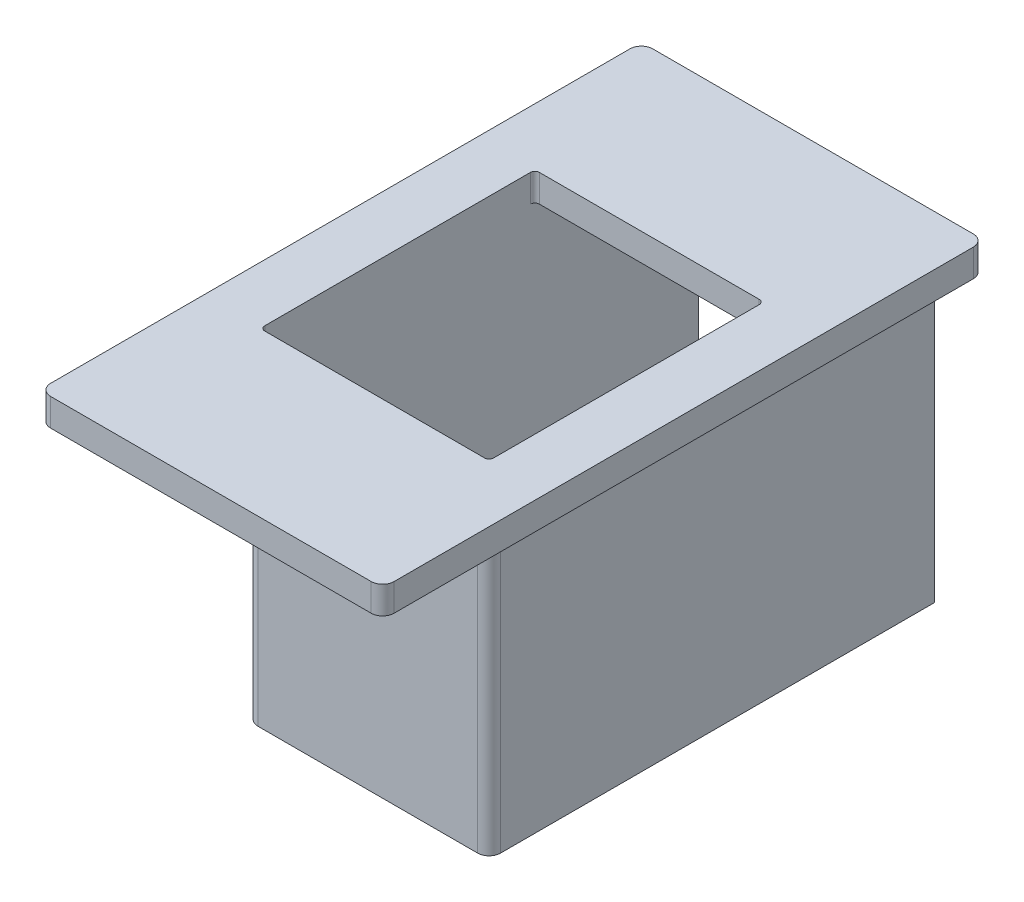
ISO-10303-21;
HEADER;
FILE_DESCRIPTION(('STEP AP214'),'2;1');
FILE_NAME('part.step','',(''),(''),'','','');
FILE_SCHEMA(('AUTOMOTIVE_DESIGN { 1 0 10303 214 1 1 1 1 }'));
ENDSEC;
DATA;
#1=APPLICATION_CONTEXT('core data for automotive mechanical design processes');
#2=APPLICATION_PROTOCOL_DEFINITION('international standard','automotive_design',2000,#1);
#3=PRODUCT_CONTEXT('',#1,'mechanical');
#4=PRODUCT('Part','Part','',(#3));
#5=PRODUCT_RELATED_PRODUCT_CATEGORY('part','',(#4));
#6=PRODUCT_DEFINITION_FORMATION('','',#4);
#7=PRODUCT_DEFINITION_CONTEXT('part definition',#1,'design');
#8=PRODUCT_DEFINITION('design','',#6,#7);
#9=PRODUCT_DEFINITION_SHAPE('','',#8);
#10=(LENGTH_UNIT() NAMED_UNIT(*) SI_UNIT(.MILLI.,.METRE.));
#11=(NAMED_UNIT(*) PLANE_ANGLE_UNIT() SI_UNIT($,.RADIAN.));
#12=(NAMED_UNIT(*) SI_UNIT($,.STERADIAN.) SOLID_ANGLE_UNIT());
#13=UNCERTAINTY_MEASURE_WITH_UNIT(LENGTH_MEASURE(1.E-05),#10,'distance_accuracy_value','');
#14=(GEOMETRIC_REPRESENTATION_CONTEXT(3) GLOBAL_UNCERTAINTY_ASSIGNED_CONTEXT((#13)) GLOBAL_UNIT_ASSIGNED_CONTEXT((#10,
#11,#12)) REPRESENTATION_CONTEXT('',''));
#15=CARTESIAN_POINT('',(0.,0.,0.));
#16=DIRECTION('',(0.,0.,1.));
#17=DIRECTION('',(1.,0.,0.));
#18=AXIS2_PLACEMENT_3D('',#15,#16,#17);
#19=CARTESIAN_POINT('',(-500.,120.,-600.));
#20=DIRECTION('',(0.,0.,1.));
#21=DIRECTION('',(1.,0.,0.));
#22=AXIS2_PLACEMENT_3D('',#19,#20,#21);
#23=PLANE('',#22);
#24=DIRECTION('',(0.,-1.,0.));
#25=VECTOR('',#24,1.);
#26=CARTESIAN_POINT('',(-480.,0.,-600.));
#27=LINE('',#26,#25);
#28=CARTESIAN_POINT('',(-480.,120.,-600.));
#29=VERTEX_POINT('',#28);
#30=CARTESIAN_POINT('',(-480.,0.,-600.));
#31=VERTEX_POINT('',#30);
#32=EDGE_CURVE('E223',#29,#31,#27,.T.);
#33=ORIENTED_EDGE('',*,*,#32,.T.);
#34=DIRECTION('',(1.,0.,0.));
#35=VECTOR('',#34,1.);
#36=CARTESIAN_POINT('',(-500.,0.,-600.));
#37=LINE('',#36,#35);
#38=CARTESIAN_POINT('',(480.,0.,-600.));
#39=VERTEX_POINT('',#38);
#40=EDGE_CURVE('E212',#31,#39,#37,.T.);
#41=ORIENTED_EDGE('',*,*,#40,.T.);
#42=DIRECTION('',(0.,-1.,0.));
#43=VECTOR('',#42,1.);
#44=CARTESIAN_POINT('',(480.,120.,-600.));
#45=LINE('',#44,#43);
#46=CARTESIAN_POINT('',(480.,120.,-600.));
#47=VERTEX_POINT('',#46);
#48=EDGE_CURVE('E211',#39,#47,#45,.F.);
#49=ORIENTED_EDGE('',*,*,#48,.T.);
#50=DIRECTION('',(-1.,0.,0.));
#51=VECTOR('',#50,1.);
#52=CARTESIAN_POINT('',(-500.,120.,-600.));
#53=LINE('',#52,#51);
#54=EDGE_CURVE('E268',#47,#29,#53,.T.);
#55=ORIENTED_EDGE('',*,*,#54,.T.);
#56=EDGE_LOOP('',(#33,#41,#49,#55));
#57=FACE_BOUND('',#56,.T.);
#58=ADVANCED_FACE('F33',(#57),#23,.T.);
#59=CARTESIAN_POINT('',(-480.,120.,-580.));
#60=DIRECTION('',(0.,1.,0.));
#61=DIRECTION('',(0.,0.,1.));
#62=AXIS2_PLACEMENT_3D('',#59,#60,#61);
#63=CYLINDRICAL_SURFACE('',#62,20.);
#64=CARTESIAN_POINT('',(-480.,0.,-580.));
#65=DIRECTION('',(0.,-1.,0.));
#66=DIRECTION('',(0.,0.,-1.));
#67=AXIS2_PLACEMENT_3D('',#64,#65,#66);
#68=CIRCLE('',#67,20.);
#69=CARTESIAN_POINT('',(-500.,0.,-580.));
#70=VERTEX_POINT('',#69);
#71=EDGE_CURVE('E354',#31,#70,#68,.F.);
#72=ORIENTED_EDGE('',*,*,#71,.F.);
#73=ORIENTED_EDGE('',*,*,#32,.F.);
#74=CARTESIAN_POINT('',(-480.,120.,-580.));
#75=DIRECTION('',(0.,-1.,0.));
#76=DIRECTION('',(0.,0.,-1.));
#77=AXIS2_PLACEMENT_3D('',#74,#75,#76);
#78=CIRCLE('',#77,20.);
#79=CARTESIAN_POINT('',(-500.,120.,-580.));
#80=VERTEX_POINT('',#79);
#81=EDGE_CURVE('E221',#80,#29,#78,.T.);
#82=ORIENTED_EDGE('',*,*,#81,.F.);
#83=DIRECTION('',(0.,-1.,0.));
#84=VECTOR('',#83,1.);
#85=CARTESIAN_POINT('',(-500.,120.,-580.));
#86=LINE('',#85,#84);
#87=EDGE_CURVE('E336',#70,#80,#86,.F.);
#88=ORIENTED_EDGE('',*,*,#87,.F.);
#89=EDGE_LOOP('',(#72,#73,#82,#88));
#90=FACE_BOUND('',#89,.T.);
#91=ADVANCED_FACE('F352',(#90),#63,.F.);
#92=CARTESIAN_POINT('',(480.,120.,-580.));
#93=DIRECTION('',(0.,1.,0.));
#94=DIRECTION('',(0.,0.,1.));
#95=AXIS2_PLACEMENT_3D('',#92,#93,#94);
#96=CYLINDRICAL_SURFACE('',#95,20.);
#97=CARTESIAN_POINT('',(480.,0.,-580.));
#98=DIRECTION('',(0.,-1.,0.));
#99=DIRECTION('',(0.,0.,-1.));
#100=AXIS2_PLACEMENT_3D('',#97,#98,#99);
#101=CIRCLE('',#100,20.);
#102=CARTESIAN_POINT('',(500.,0.,-580.));
#103=VERTEX_POINT('',#102);
#104=EDGE_CURVE('E195',#103,#39,#101,.F.);
#105=ORIENTED_EDGE('',*,*,#104,.F.);
#106=DIRECTION('',(0.,-1.,0.));
#107=VECTOR('',#106,1.);
#108=CARTESIAN_POINT('',(500.,0.,-580.));
#109=LINE('',#108,#107);
#110=CARTESIAN_POINT('',(500.,120.,-580.));
#111=VERTEX_POINT('',#110);
#112=EDGE_CURVE('E210',#111,#103,#109,.T.);
#113=ORIENTED_EDGE('',*,*,#112,.F.);
#114=CARTESIAN_POINT('',(480.,120.,-580.));
#115=DIRECTION('',(0.,-1.,0.));
#116=DIRECTION('',(0.,0.,-1.));
#117=AXIS2_PLACEMENT_3D('',#114,#115,#116);
#118=CIRCLE('',#117,20.);
#119=EDGE_CURVE('E228',#47,#111,#118,.T.);
#120=ORIENTED_EDGE('',*,*,#119,.F.);
#121=ORIENTED_EDGE('',*,*,#48,.F.);
#122=EDGE_LOOP('',(#105,#113,#120,#121));
#123=FACE_BOUND('',#122,.T.);
#124=ADVANCED_FACE('F208',(#123),#96,.F.);
#125=CARTESIAN_POINT('',(700.,0.,-1265.));
#126=DIRECTION('',(0.,-1.,0.));
#127=DIRECTION('',(0.,0.,-1.));
#128=AXIS2_PLACEMENT_3D('',#125,#126,#127);
#129=PLANE('',#128);
#130=DIRECTION('',(-1.,0.,0.));
#131=VECTOR('',#130,1.);
#132=CARTESIAN_POINT('',(-700.,0.,-1315.));
#133=LINE('',#132,#131);
#134=CARTESIAN_POINT('',(500.,0.,-1315.));
#135=VERTEX_POINT('',#134);
#136=CARTESIAN_POINT('',(-500.,0.,-1315.));
#137=VERTEX_POINT('',#136);
#138=EDGE_CURVE('E197',#135,#137,#133,.T.);
#139=ORIENTED_EDGE('',*,*,#138,.F.);
#140=DIRECTION('',(0.,0.,-1.));
#141=VECTOR('',#140,1.);
#142=CARTESIAN_POINT('',(500.,0.,-580.));
#143=LINE('',#142,#141);
#144=EDGE_CURVE('E192',#103,#135,#143,.T.);
#145=ORIENTED_EDGE('',*,*,#144,.F.);
#146=ORIENTED_EDGE('',*,*,#104,.T.);
#147=ORIENTED_EDGE('',*,*,#40,.F.);
#148=ORIENTED_EDGE('',*,*,#71,.T.);
#149=DIRECTION('',(0.,0.,1.));
#150=VECTOR('',#149,1.);
#151=CARTESIAN_POINT('',(-500.,0.,-580.));
#152=LINE('',#151,#150);
#153=EDGE_CURVE('E55',#137,#70,#152,.T.);
#154=ORIENTED_EDGE('',*,*,#153,.F.);
#155=EDGE_LOOP('',(#139,#145,#146,#147,#148,#154));
#156=FACE_BOUND('',#155,.T.);
#157=ADVANCED_FACE('F194',(#156),#129,.T.);
#158=CARTESIAN_POINT('',(-530.,0.,-1315.));
#159=VERTEX_POINT('',#158);
#160=CARTESIAN_POINT('',(-700.,0.,-1315.));
#161=VERTEX_POINT('',#160);
#162=EDGE_CURVE('E299',#159,#161,#133,.T.);
#163=ORIENTED_EDGE('',*,*,#162,.F.);
#164=DIRECTION('',(0.,0.,-1.));
#165=VECTOR('',#164,1.);
#166=CARTESIAN_POINT('',(-530.,0.,-1265.));
#167=LINE('',#166,#165);
#168=CARTESIAN_POINT('',(-530.,0.,580.));
#169=VERTEX_POINT('',#168);
#170=EDGE_CURVE('E41',#169,#159,#167,.T.);
#171=ORIENTED_EDGE('',*,*,#170,.F.);
#172=CARTESIAN_POINT('',(-480.,0.,580.));
#173=DIRECTION('',(0.,-1.,0.));
#174=DIRECTION('',(0.,0.,-1.));
#175=AXIS2_PLACEMENT_3D('',#172,#173,#174);
#176=CIRCLE('',#175,50.0000000000002);
#177=CARTESIAN_POINT('',(-480.,0.,630.));
#178=VERTEX_POINT('',#177);
#179=EDGE_CURVE('E11',#178,#169,#176,.T.);
#180=ORIENTED_EDGE('',*,*,#179,.F.);
#181=DIRECTION('',(-1.,0.,0.));
#182=VECTOR('',#181,1.);
#183=CARTESIAN_POINT('',(700.,0.,630.));
#184=LINE('',#183,#182);
#185=CARTESIAN_POINT('',(480.,0.,630.));
#186=VERTEX_POINT('',#185);
#187=EDGE_CURVE('E232',#186,#178,#184,.T.);
#188=ORIENTED_EDGE('',*,*,#187,.F.);
#189=CARTESIAN_POINT('',(480.,0.,580.));
#190=DIRECTION('',(0.,-1.,0.));
#191=DIRECTION('',(0.,0.,-1.));
#192=AXIS2_PLACEMENT_3D('',#189,#190,#191);
#193=CIRCLE('',#192,50.);
#194=CARTESIAN_POINT('',(530.,0.,580.));
#195=VERTEX_POINT('',#194);
#196=EDGE_CURVE('E235',#195,#186,#193,.T.);
#197=ORIENTED_EDGE('',*,*,#196,.F.);
#198=DIRECTION('',(0.,0.,1.));
#199=VECTOR('',#198,1.);
#200=CARTESIAN_POINT('',(530.,0.,-1265.));
#201=LINE('',#200,#199);
#202=CARTESIAN_POINT('',(530.,0.,-1315.));
#203=VERTEX_POINT('',#202);
#204=EDGE_CURVE('E238',#203,#195,#201,.T.);
#205=ORIENTED_EDGE('',*,*,#204,.F.);
#206=CARTESIAN_POINT('',(700.,0.,-1315.));
#207=VERTEX_POINT('',#206);
#208=EDGE_CURVE('E300',#207,#203,#133,.T.);
#209=ORIENTED_EDGE('',*,*,#208,.F.);
#210=CARTESIAN_POINT('',(700.,0.,-1265.));
#211=DIRECTION('',(0.,1.,0.));
#212=DIRECTION('',(0.,0.,-1.));
#213=AXIS2_PLACEMENT_3D('',#210,#211,#212);
#214=CIRCLE('',#213,50.);
#215=CARTESIAN_POINT('',(750.,0.,-1265.));
#216=VERTEX_POINT('',#215);
#217=EDGE_CURVE('E277',#216,#207,#214,.T.);
#218=ORIENTED_EDGE('',*,*,#217,.F.);
#219=DIRECTION('',(0.,0.,-1.));
#220=VECTOR('',#219,1.);
#221=CARTESIAN_POINT('',(750.,0.,-1265.));
#222=LINE('',#221,#220);
#223=CARTESIAN_POINT('',(750.,0.,1265.));
#224=VERTEX_POINT('',#223);
#225=EDGE_CURVE('E282',#224,#216,#222,.T.);
#226=ORIENTED_EDGE('',*,*,#225,.F.);
#227=CARTESIAN_POINT('',(700.,0.,1265.));
#228=DIRECTION('',(0.,1.,0.));
#229=DIRECTION('',(0.,0.,1.));
#230=AXIS2_PLACEMENT_3D('',#227,#228,#229);
#231=CIRCLE('',#230,50.);
#232=CARTESIAN_POINT('',(700.,0.,1315.));
#233=VERTEX_POINT('',#232);
#234=EDGE_CURVE('E310',#233,#224,#231,.T.);
#235=ORIENTED_EDGE('',*,*,#234,.F.);
#236=DIRECTION('',(1.,0.,0.));
#237=VECTOR('',#236,1.);
#238=CARTESIAN_POINT('',(-700.,0.,1315.));
#239=LINE('',#238,#237);
#240=CARTESIAN_POINT('',(-700.,0.,1315.));
#241=VERTEX_POINT('',#240);
#242=EDGE_CURVE('E308',#241,#233,#239,.T.);
#243=ORIENTED_EDGE('',*,*,#242,.F.);
#244=CARTESIAN_POINT('',(-700.,0.,1265.));
#245=DIRECTION('',(0.,1.,0.));
#246=DIRECTION('',(0.,0.,1.));
#247=AXIS2_PLACEMENT_3D('',#244,#245,#246);
#248=CIRCLE('',#247,50.);
#249=CARTESIAN_POINT('',(-750.,0.,1265.));
#250=VERTEX_POINT('',#249);
#251=EDGE_CURVE('E306',#250,#241,#248,.T.);
#252=ORIENTED_EDGE('',*,*,#251,.F.);
#253=DIRECTION('',(0.,0.,1.));
#254=VECTOR('',#253,1.);
#255=CARTESIAN_POINT('',(-750.,0.,-1265.));
#256=LINE('',#255,#254);
#257=CARTESIAN_POINT('',(-750.,0.,-1265.));
#258=VERTEX_POINT('',#257);
#259=EDGE_CURVE('E304',#258,#250,#256,.T.);
#260=ORIENTED_EDGE('',*,*,#259,.F.);
#261=CARTESIAN_POINT('',(-700.,0.,-1265.));
#262=DIRECTION('',(0.,1.,0.));
#263=DIRECTION('',(0.,0.,1.));
#264=AXIS2_PLACEMENT_3D('',#261,#262,#263);
#265=CIRCLE('',#264,50.);
#266=EDGE_CURVE('E302',#161,#258,#265,.T.);
#267=ORIENTED_EDGE('',*,*,#266,.F.);
#268=EDGE_LOOP('',(#163,#171,#180,#188,#197,#205,#209,#218,#226,#235,#243,#252,#260,#267));
#269=FACE_BOUND('',#268,.T.);
#270=ADVANCED_FACE('F402',(#269),#129,.T.);
#271=CARTESIAN_POINT('',(700.,120.,-1265.));
#272=DIRECTION('',(0.,-1.,0.));
#273=DIRECTION('',(0.,0.,-1.));
#274=AXIS2_PLACEMENT_3D('',#271,#272,#273);
#275=PLANE('',#274);
#276=CARTESIAN_POINT('',(700.,120.,-1265.));
#277=DIRECTION('',(0.,1.,0.));
#278=DIRECTION('',(0.,0.,-1.));
#279=AXIS2_PLACEMENT_3D('',#276,#277,#278);
#280=CIRCLE('',#279,50.);
#281=CARTESIAN_POINT('',(750.,120.,-1265.));
#282=VERTEX_POINT('',#281);
#283=CARTESIAN_POINT('',(700.,120.,-1315.));
#284=VERTEX_POINT('',#283);
#285=EDGE_CURVE('E278',#282,#284,#280,.T.);
#286=ORIENTED_EDGE('',*,*,#285,.T.);
#287=DIRECTION('',(-1.,0.,0.));
#288=VECTOR('',#287,1.);
#289=CARTESIAN_POINT('',(-700.,120.,-1315.));
#290=LINE('',#289,#288);
#291=CARTESIAN_POINT('',(-700.,120.,-1315.));
#292=VERTEX_POINT('',#291);
#293=EDGE_CURVE('E281',#284,#292,#290,.T.);
#294=ORIENTED_EDGE('',*,*,#293,.T.);
#295=CARTESIAN_POINT('',(-700.,120.,-1265.));
#296=DIRECTION('',(0.,1.,0.));
#297=DIRECTION('',(0.,0.,1.));
#298=AXIS2_PLACEMENT_3D('',#295,#296,#297);
#299=CIRCLE('',#298,50.);
#300=CARTESIAN_POINT('',(-750.,120.,-1265.));
#301=VERTEX_POINT('',#300);
#302=EDGE_CURVE('E284',#292,#301,#299,.T.);
#303=ORIENTED_EDGE('',*,*,#302,.T.);
#304=DIRECTION('',(0.,0.,1.));
#305=VECTOR('',#304,1.);
#306=CARTESIAN_POINT('',(-750.,120.,-1265.));
#307=LINE('',#306,#305);
#308=CARTESIAN_POINT('',(-750.,120.,1265.));
#309=VERTEX_POINT('',#308);
#310=EDGE_CURVE('E286',#301,#309,#307,.T.);
#311=ORIENTED_EDGE('',*,*,#310,.T.);
#312=CARTESIAN_POINT('',(-700.,120.,1265.));
#313=DIRECTION('',(0.,1.,0.));
#314=DIRECTION('',(0.,0.,1.));
#315=AXIS2_PLACEMENT_3D('',#312,#313,#314);
#316=CIRCLE('',#315,50.);
#317=CARTESIAN_POINT('',(-700.,120.,1315.));
#318=VERTEX_POINT('',#317);
#319=EDGE_CURVE('E288',#309,#318,#316,.T.);
#320=ORIENTED_EDGE('',*,*,#319,.T.);
#321=DIRECTION('',(1.,0.,0.));
#322=VECTOR('',#321,1.);
#323=CARTESIAN_POINT('',(-700.,120.,1315.));
#324=LINE('',#323,#322);
#325=CARTESIAN_POINT('',(700.,120.,1315.));
#326=VERTEX_POINT('',#325);
#327=EDGE_CURVE('E290',#318,#326,#324,.T.);
#328=ORIENTED_EDGE('',*,*,#327,.T.);
#329=CARTESIAN_POINT('',(700.,120.,1265.));
#330=DIRECTION('',(0.,1.,0.));
#331=DIRECTION('',(0.,0.,1.));
#332=AXIS2_PLACEMENT_3D('',#329,#330,#331);
#333=CIRCLE('',#332,50.);
#334=CARTESIAN_POINT('',(750.,120.,1265.));
#335=VERTEX_POINT('',#334);
#336=EDGE_CURVE('E292',#326,#335,#333,.T.);
#337=ORIENTED_EDGE('',*,*,#336,.T.);
#338=DIRECTION('',(0.,0.,-1.));
#339=VECTOR('',#338,1.);
#340=CARTESIAN_POINT('',(750.,120.,-1265.));
#341=LINE('',#340,#339);
#342=EDGE_CURVE('E294',#335,#282,#341,.T.);
#343=ORIENTED_EDGE('',*,*,#342,.T.);
#344=EDGE_LOOP('',(#286,#294,#303,#311,#320,#328,#337,#343));
#345=FACE_BOUND('',#344,.T.);
#346=DIRECTION('',(0.,0.,-1.));
#347=VECTOR('',#346,1.);
#348=CARTESIAN_POINT('',(500.,120.,-600.));
#349=LINE('',#348,#347);
#350=CARTESIAN_POINT('',(500.,120.,580.));
#351=VERTEX_POINT('',#350);
#352=EDGE_CURVE('E217',#351,#111,#349,.T.);
#353=ORIENTED_EDGE('',*,*,#352,.F.);
#354=CARTESIAN_POINT('',(480.,120.,580.));
#355=DIRECTION('',(0.,-1.,0.));
#356=DIRECTION('',(0.,0.,-1.));
#357=AXIS2_PLACEMENT_3D('',#354,#355,#356);
#358=CIRCLE('',#357,20.);
#359=CARTESIAN_POINT('',(480.,120.,600.));
#360=VERTEX_POINT('',#359);
#361=EDGE_CURVE('E230',#351,#360,#358,.T.);
#362=ORIENTED_EDGE('',*,*,#361,.T.);
#363=DIRECTION('',(1.,0.,0.));
#364=VECTOR('',#363,1.);
#365=CARTESIAN_POINT('',(-500.,120.,600.));
#366=LINE('',#365,#364);
#367=CARTESIAN_POINT('',(-480.,120.,600.));
#368=VERTEX_POINT('',#367);
#369=EDGE_CURVE('E274',#368,#360,#366,.T.);
#370=ORIENTED_EDGE('',*,*,#369,.F.);
#371=CARTESIAN_POINT('',(-480.,120.,580.));
#372=DIRECTION('',(0.,-1.,0.));
#373=DIRECTION('',(0.,0.,-1.));
#374=AXIS2_PLACEMENT_3D('',#371,#372,#373);
#375=CIRCLE('',#374,20.);
#376=CARTESIAN_POINT('',(-500.,120.,580.));
#377=VERTEX_POINT('',#376);
#378=EDGE_CURVE('E218',#368,#377,#375,.T.);
#379=ORIENTED_EDGE('',*,*,#378,.T.);
#380=DIRECTION('',(0.,0.,1.));
#381=VECTOR('',#380,1.);
#382=CARTESIAN_POINT('',(-500.,120.,-600.));
#383=LINE('',#382,#381);
#384=EDGE_CURVE('E271',#80,#377,#383,.T.);
#385=ORIENTED_EDGE('',*,*,#384,.F.);
#386=ORIENTED_EDGE('',*,*,#81,.T.);
#387=ORIENTED_EDGE('',*,*,#54,.F.);
#388=ORIENTED_EDGE('',*,*,#119,.T.);
#389=EDGE_LOOP('',(#353,#362,#370,#379,#385,#386,#387,#388));
#390=FACE_BOUND('',#389,.T.);
#391=ADVANCED_FACE('F462',(#345,#390),#275,.F.);
#392=CARTESIAN_POINT('',(700.,120.,-1265.));
#393=DIRECTION('',(0.,-1.,0.));
#394=DIRECTION('',(0.,0.,-1.));
#395=AXIS2_PLACEMENT_3D('',#392,#393,#394);
#396=CYLINDRICAL_SURFACE('',#395,50.);
#397=ORIENTED_EDGE('',*,*,#217,.T.);
#398=DIRECTION('',(0.,-1.,0.));
#399=VECTOR('',#398,1.);
#400=CARTESIAN_POINT('',(700.,120.,-1315.));
#401=LINE('',#400,#399);
#402=EDGE_CURVE('E333',#284,#207,#401,.T.);
#403=ORIENTED_EDGE('',*,*,#402,.F.);
#404=ORIENTED_EDGE('',*,*,#285,.F.);
#405=DIRECTION('',(0.,-1.,0.));
#406=VECTOR('',#405,1.);
#407=CARTESIAN_POINT('',(750.,120.,-1265.));
#408=LINE('',#407,#406);
#409=EDGE_CURVE('E296',#282,#216,#408,.T.);
#410=ORIENTED_EDGE('',*,*,#409,.T.);
#411=EDGE_LOOP('',(#397,#403,#404,#410));
#412=FACE_BOUND('',#411,.T.);
#413=ADVANCED_FACE('F413',(#412),#396,.T.);
#414=CARTESIAN_POINT('',(-700.,120.,-1315.));
#415=DIRECTION('',(0.,0.,1.));
#416=DIRECTION('',(1.,0.,0.));
#417=AXIS2_PLACEMENT_3D('',#414,#415,#416);
#418=PLANE('',#417);
#419=ORIENTED_EDGE('',*,*,#208,.T.);
#420=DIRECTION('',(0.,1.,0.));
#421=VECTOR('',#420,1.);
#422=CARTESIAN_POINT('',(530.,-2095.61199011435,-1315.));
#423=LINE('',#422,#421);
#424=CARTESIAN_POINT('',(530.,-1360.,-1315.));
#425=VERTEX_POINT('',#424);
#426=EDGE_CURVE('E247',#425,#203,#423,.T.);
#427=ORIENTED_EDGE('',*,*,#426,.F.);
#428=DIRECTION('',(1.,0.,0.));
#429=VECTOR('',#428,1.);
#430=CARTESIAN_POINT('',(500.,-1360.,-1315.));
#431=LINE('',#430,#429);
#432=CARTESIAN_POINT('',(500.,-1360.,-1315.));
#433=VERTEX_POINT('',#432);
#434=EDGE_CURVE('E367',#433,#425,#431,.T.);
#435=ORIENTED_EDGE('',*,*,#434,.F.);
#436=DIRECTION('',(0.,1.,0.));
#437=VECTOR('',#436,1.);
#438=CARTESIAN_POINT('',(500.,-2095.61199011435,-1315.));
#439=LINE('',#438,#437);
#440=EDGE_CURVE('E202',#433,#135,#439,.T.);
#441=ORIENTED_EDGE('',*,*,#440,.T.);
#442=ORIENTED_EDGE('',*,*,#138,.T.);
#443=DIRECTION('',(0.,1.,0.));
#444=VECTOR('',#443,1.);
#445=CARTESIAN_POINT('',(-500.,-2095.61199011435,-1315.));
#446=LINE('',#445,#444);
#447=CARTESIAN_POINT('',(-500.,-1360.,-1315.));
#448=VERTEX_POINT('',#447);
#449=EDGE_CURVE('E355',#448,#137,#446,.T.);
#450=ORIENTED_EDGE('',*,*,#449,.F.);
#451=DIRECTION('',(1.,0.,0.));
#452=VECTOR('',#451,1.);
#453=CARTESIAN_POINT('',(-500.,-1360.,-1315.));
#454=LINE('',#453,#452);
#455=CARTESIAN_POINT('',(-530.,-1360.,-1315.));
#456=VERTEX_POINT('',#455);
#457=EDGE_CURVE('E203',#456,#448,#454,.T.);
#458=ORIENTED_EDGE('',*,*,#457,.F.);
#459=DIRECTION('',(0.,1.,0.));
#460=VECTOR('',#459,1.);
#461=CARTESIAN_POINT('',(-530.,-2095.61199011435,-1315.));
#462=LINE('',#461,#460);
#463=EDGE_CURVE('E362',#456,#159,#462,.T.);
#464=ORIENTED_EDGE('',*,*,#463,.T.);
#465=ORIENTED_EDGE('',*,*,#162,.T.);
#466=DIRECTION('',(0.,-1.,0.));
#467=VECTOR('',#466,1.);
#468=CARTESIAN_POINT('',(-700.,120.,-1315.));
#469=LINE('',#468,#467);
#470=EDGE_CURVE('E330',#292,#161,#469,.T.);
#471=ORIENTED_EDGE('',*,*,#470,.F.);
#472=ORIENTED_EDGE('',*,*,#293,.F.);
#473=ORIENTED_EDGE('',*,*,#402,.T.);
#474=EDGE_LOOP('',(#419,#427,#435,#441,#442,#450,#458,#464,#465,#471,#472,#473));
#475=FACE_BOUND('',#474,.T.);
#476=ADVANCED_FACE('F407',(#475),#418,.F.);
#477=CARTESIAN_POINT('',(-700.,120.,-1265.));
#478=DIRECTION('',(0.,-1.,0.));
#479=DIRECTION('',(0.,0.,-1.));
#480=AXIS2_PLACEMENT_3D('',#477,#478,#479);
#481=CYLINDRICAL_SURFACE('',#480,50.);
#482=ORIENTED_EDGE('',*,*,#266,.T.);
#483=DIRECTION('',(0.,-1.,0.));
#484=VECTOR('',#483,1.);
#485=CARTESIAN_POINT('',(-750.,120.,-1265.));
#486=LINE('',#485,#484);
#487=EDGE_CURVE('E327',#301,#258,#486,.T.);
#488=ORIENTED_EDGE('',*,*,#487,.F.);
#489=ORIENTED_EDGE('',*,*,#302,.F.);
#490=ORIENTED_EDGE('',*,*,#470,.T.);
#491=EDGE_LOOP('',(#482,#488,#489,#490));
#492=FACE_BOUND('',#491,.T.);
#493=ADVANCED_FACE('F441',(#492),#481,.T.);
#494=CARTESIAN_POINT('',(-750.,120.,-1265.));
#495=DIRECTION('',(1.,0.,0.));
#496=DIRECTION('',(0.,0.,-1.));
#497=AXIS2_PLACEMENT_3D('',#494,#495,#496);
#498=PLANE('',#497);
#499=ORIENTED_EDGE('',*,*,#259,.T.);
#500=DIRECTION('',(0.,-1.,0.));
#501=VECTOR('',#500,1.);
#502=CARTESIAN_POINT('',(-750.,120.,1265.));
#503=LINE('',#502,#501);
#504=EDGE_CURVE('E324',#309,#250,#503,.T.);
#505=ORIENTED_EDGE('',*,*,#504,.F.);
#506=ORIENTED_EDGE('',*,*,#310,.F.);
#507=ORIENTED_EDGE('',*,*,#487,.T.);
#508=EDGE_LOOP('',(#499,#505,#506,#507));
#509=FACE_BOUND('',#508,.T.);
#510=ADVANCED_FACE('F437',(#509),#498,.F.);
#511=CARTESIAN_POINT('',(-700.,120.,1265.));
#512=DIRECTION('',(0.,-1.,0.));
#513=DIRECTION('',(0.,0.,-1.));
#514=AXIS2_PLACEMENT_3D('',#511,#512,#513);
#515=CYLINDRICAL_SURFACE('',#514,50.);
#516=ORIENTED_EDGE('',*,*,#251,.T.);
#517=DIRECTION('',(0.,-1.,0.));
#518=VECTOR('',#517,1.);
#519=CARTESIAN_POINT('',(-700.,120.,1315.));
#520=LINE('',#519,#518);
#521=EDGE_CURVE('E321',#318,#241,#520,.T.);
#522=ORIENTED_EDGE('',*,*,#521,.F.);
#523=ORIENTED_EDGE('',*,*,#319,.F.);
#524=ORIENTED_EDGE('',*,*,#504,.T.);
#525=EDGE_LOOP('',(#516,#522,#523,#524));
#526=FACE_BOUND('',#525,.T.);
#527=ADVANCED_FACE('F433',(#526),#515,.T.);
#528=CARTESIAN_POINT('',(-700.,120.,1315.));
#529=DIRECTION('',(0.,0.,-1.));
#530=DIRECTION('',(-1.,0.,0.));
#531=AXIS2_PLACEMENT_3D('',#528,#529,#530);
#532=PLANE('',#531);
#533=ORIENTED_EDGE('',*,*,#242,.T.);
#534=DIRECTION('',(0.,-1.,0.));
#535=VECTOR('',#534,1.);
#536=CARTESIAN_POINT('',(700.,120.,1315.));
#537=LINE('',#536,#535);
#538=EDGE_CURVE('E318',#326,#233,#537,.T.);
#539=ORIENTED_EDGE('',*,*,#538,.F.);
#540=ORIENTED_EDGE('',*,*,#327,.F.);
#541=ORIENTED_EDGE('',*,*,#521,.T.);
#542=EDGE_LOOP('',(#533,#539,#540,#541));
#543=FACE_BOUND('',#542,.T.);
#544=ADVANCED_FACE('F428',(#543),#532,.F.);
#545=CARTESIAN_POINT('',(700.,120.,1265.));
#546=DIRECTION('',(0.,-1.,0.));
#547=DIRECTION('',(0.,0.,-1.));
#548=AXIS2_PLACEMENT_3D('',#545,#546,#547);
#549=CYLINDRICAL_SURFACE('',#548,50.);
#550=ORIENTED_EDGE('',*,*,#234,.T.);
#551=DIRECTION('',(0.,-1.,0.));
#552=VECTOR('',#551,1.);
#553=CARTESIAN_POINT('',(750.,120.,1265.));
#554=LINE('',#553,#552);
#555=EDGE_CURVE('E315',#335,#224,#554,.T.);
#556=ORIENTED_EDGE('',*,*,#555,.F.);
#557=ORIENTED_EDGE('',*,*,#336,.F.);
#558=ORIENTED_EDGE('',*,*,#538,.T.);
#559=EDGE_LOOP('',(#550,#556,#557,#558));
#560=FACE_BOUND('',#559,.T.);
#561=ADVANCED_FACE('F422',(#560),#549,.T.);
#562=CARTESIAN_POINT('',(750.,120.,-1265.));
#563=DIRECTION('',(-1.,0.,0.));
#564=DIRECTION('',(0.,0.,1.));
#565=AXIS2_PLACEMENT_3D('',#562,#563,#564);
#566=PLANE('',#565);
#567=ORIENTED_EDGE('',*,*,#225,.T.);
#568=ORIENTED_EDGE('',*,*,#409,.F.);
#569=ORIENTED_EDGE('',*,*,#342,.F.);
#570=ORIENTED_EDGE('',*,*,#555,.T.);
#571=EDGE_LOOP('',(#567,#568,#569,#570));
#572=FACE_BOUND('',#571,.T.);
#573=ADVANCED_FACE('F418',(#572),#566,.F.);
#574=CARTESIAN_POINT('',(500.,120.,-600.));
#575=DIRECTION('',(-1.,0.,0.));
#576=DIRECTION('',(0.,0.,1.));
#577=AXIS2_PLACEMENT_3D('',#574,#575,#576);
#578=PLANE('',#577);
#579=ORIENTED_EDGE('',*,*,#440,.F.);
#580=DIRECTION('',(0.,0.,-1.));
#581=VECTOR('',#580,1.);
#582=CARTESIAN_POINT('',(500.,-1360.,-580.));
#583=LINE('',#582,#581);
#584=CARTESIAN_POINT('',(500.,-1360.,580.));
#585=VERTEX_POINT('',#584);
#586=EDGE_CURVE('E381',#585,#433,#583,.T.);
#587=ORIENTED_EDGE('',*,*,#586,.F.);
#588=DIRECTION('',(0.,-1.,0.));
#589=VECTOR('',#588,1.);
#590=CARTESIAN_POINT('',(500.,120.,580.));
#591=LINE('',#590,#589);
#592=EDGE_CURVE('E219',#585,#351,#591,.F.);
#593=ORIENTED_EDGE('',*,*,#592,.T.);
#594=ORIENTED_EDGE('',*,*,#352,.T.);
#595=ORIENTED_EDGE('',*,*,#112,.T.);
#596=ORIENTED_EDGE('',*,*,#144,.T.);
#597=EDGE_LOOP('',(#579,#587,#593,#594,#595,#596));
#598=FACE_BOUND('',#597,.T.);
#599=ADVANCED_FACE('F215',(#598),#578,.T.);
#600=CARTESIAN_POINT('',(-500.,120.,-600.));
#601=DIRECTION('',(1.,0.,0.));
#602=DIRECTION('',(0.,0.,-1.));
#603=AXIS2_PLACEMENT_3D('',#600,#601,#602);
#604=PLANE('',#603);
#605=DIRECTION('',(0.,-1.,0.));
#606=VECTOR('',#605,1.);
#607=CARTESIAN_POINT('',(-500.,0.,580.));
#608=LINE('',#607,#606);
#609=CARTESIAN_POINT('',(-500.,-1360.,580.));
#610=VERTEX_POINT('',#609);
#611=EDGE_CURVE('E338',#377,#610,#608,.T.);
#612=ORIENTED_EDGE('',*,*,#611,.T.);
#613=DIRECTION('',(0.,0.,1.));
#614=VECTOR('',#613,1.);
#615=CARTESIAN_POINT('',(-500.,-1360.,580.));
#616=LINE('',#615,#614);
#617=EDGE_CURVE('E383',#448,#610,#616,.T.);
#618=ORIENTED_EDGE('',*,*,#617,.F.);
#619=ORIENTED_EDGE('',*,*,#449,.T.);
#620=ORIENTED_EDGE('',*,*,#153,.T.);
#621=ORIENTED_EDGE('',*,*,#87,.T.);
#622=ORIENTED_EDGE('',*,*,#384,.T.);
#623=EDGE_LOOP('',(#612,#618,#619,#620,#621,#622));
#624=FACE_BOUND('',#623,.T.);
#625=ADVANCED_FACE('F446',(#624),#604,.T.);
#626=CARTESIAN_POINT('',(-500.,120.,600.));
#627=DIRECTION('',(0.,0.,-1.));
#628=DIRECTION('',(-1.,0.,0.));
#629=AXIS2_PLACEMENT_3D('',#626,#627,#628);
#630=PLANE('',#629);
#631=DIRECTION('',(0.,-1.,0.));
#632=VECTOR('',#631,1.);
#633=CARTESIAN_POINT('',(480.,0.,600.));
#634=LINE('',#633,#632);
#635=CARTESIAN_POINT('',(480.,-1360.,600.));
#636=VERTEX_POINT('',#635);
#637=EDGE_CURVE('E341',#360,#636,#634,.T.);
#638=ORIENTED_EDGE('',*,*,#637,.T.);
#639=DIRECTION('',(1.,0.,0.));
#640=VECTOR('',#639,1.);
#641=CARTESIAN_POINT('',(480.,-1360.,600.));
#642=LINE('',#641,#640);
#643=CARTESIAN_POINT('',(-480.,-1360.,600.));
#644=VERTEX_POINT('',#643);
#645=EDGE_CURVE('E375',#644,#636,#642,.T.);
#646=ORIENTED_EDGE('',*,*,#645,.F.);
#647=DIRECTION('',(0.,-1.,0.));
#648=VECTOR('',#647,1.);
#649=CARTESIAN_POINT('',(-480.,120.,600.));
#650=LINE('',#649,#648);
#651=EDGE_CURVE('E343',#644,#368,#650,.F.);
#652=ORIENTED_EDGE('',*,*,#651,.T.);
#653=ORIENTED_EDGE('',*,*,#369,.T.);
#654=EDGE_LOOP('',(#638,#646,#652,#653));
#655=FACE_BOUND('',#654,.T.);
#656=ADVANCED_FACE('F455',(#655),#630,.T.);
#657=CARTESIAN_POINT('',(-480.,120.,580.));
#658=DIRECTION('',(0.,1.,0.));
#659=DIRECTION('',(0.,0.,1.));
#660=AXIS2_PLACEMENT_3D('',#657,#658,#659);
#661=CYLINDRICAL_SURFACE('',#660,20.);
#662=ORIENTED_EDGE('',*,*,#378,.F.);
#663=ORIENTED_EDGE('',*,*,#651,.F.);
#664=CARTESIAN_POINT('',(-480.,-1360.,580.));
#665=DIRECTION('',(0.,1.,0.));
#666=DIRECTION('',(0.,0.,-1.));
#667=AXIS2_PLACEMENT_3D('',#664,#665,#666);
#668=CIRCLE('',#667,20.0000000000001);
#669=EDGE_CURVE('E370',#610,#644,#668,.T.);
#670=ORIENTED_EDGE('',*,*,#669,.F.);
#671=ORIENTED_EDGE('',*,*,#611,.F.);
#672=EDGE_LOOP('',(#662,#663,#670,#671));
#673=FACE_BOUND('',#672,.T.);
#674=ADVANCED_FACE('F452',(#673),#661,.F.);
#675=CARTESIAN_POINT('',(480.,120.,580.));
#676=DIRECTION('',(0.,1.,0.));
#677=DIRECTION('',(0.,0.,1.));
#678=AXIS2_PLACEMENT_3D('',#675,#676,#677);
#679=CYLINDRICAL_SURFACE('',#678,20.);
#680=ORIENTED_EDGE('',*,*,#361,.F.);
#681=ORIENTED_EDGE('',*,*,#592,.F.);
#682=CARTESIAN_POINT('',(480.,-1360.,580.));
#683=DIRECTION('',(0.,1.,0.));
#684=DIRECTION('',(0.,0.,-1.));
#685=AXIS2_PLACEMENT_3D('',#682,#683,#684);
#686=CIRCLE('',#685,20.);
#687=EDGE_CURVE('E378',#636,#585,#686,.T.);
#688=ORIENTED_EDGE('',*,*,#687,.F.);
#689=ORIENTED_EDGE('',*,*,#637,.F.);
#690=EDGE_LOOP('',(#680,#681,#688,#689));
#691=FACE_BOUND('',#690,.T.);
#692=ADVANCED_FACE('F35',(#691),#679,.F.);
#693=CARTESIAN_POINT('',(-480.,-1360.,580.));
#694=DIRECTION('',(0.,1.,0.));
#695=DIRECTION('',(0.,0.,1.));
#696=AXIS2_PLACEMENT_3D('',#693,#694,#695);
#697=CYLINDRICAL_SURFACE('',#696,50.0000000000002);
#698=DIRECTION('',(0.,1.,0.));
#699=VECTOR('',#698,1.);
#700=CARTESIAN_POINT('',(-480.,-1360.,630.));
#701=LINE('',#700,#699);
#702=CARTESIAN_POINT('',(-480.,-1360.,630.));
#703=VERTEX_POINT('',#702);
#704=EDGE_CURVE('E260',#703,#178,#701,.T.);
#705=ORIENTED_EDGE('',*,*,#704,.T.);
#706=ORIENTED_EDGE('',*,*,#179,.T.);
#707=DIRECTION('',(0.,1.,0.));
#708=VECTOR('',#707,1.);
#709=CARTESIAN_POINT('',(-530.,-1360.,580.));
#710=LINE('',#709,#708);
#711=CARTESIAN_POINT('',(-530.,-1360.,580.));
#712=VERTEX_POINT('',#711);
#713=EDGE_CURVE('E256',#712,#169,#710,.T.);
#714=ORIENTED_EDGE('',*,*,#713,.F.);
#715=CARTESIAN_POINT('',(-480.,-1360.,580.));
#716=DIRECTION('',(0.,1.,0.));
#717=DIRECTION('',(0.,0.,-1.));
#718=AXIS2_PLACEMENT_3D('',#715,#716,#717);
#719=CIRCLE('',#718,50.0000000000002);
#720=EDGE_CURVE('E385',#712,#703,#719,.T.);
#721=ORIENTED_EDGE('',*,*,#720,.T.);
#722=EDGE_LOOP('',(#705,#706,#714,#721));
#723=FACE_BOUND('',#722,.T.);
#724=ADVANCED_FACE('F401',(#723),#697,.T.);
#725=CARTESIAN_POINT('',(-530.,-1360.,580.));
#726=DIRECTION('',(-1.,0.,0.));
#727=DIRECTION('',(0.,0.,1.));
#728=AXIS2_PLACEMENT_3D('',#725,#726,#727);
#729=PLANE('',#728);
#730=ORIENTED_EDGE('',*,*,#713,.T.);
#731=ORIENTED_EDGE('',*,*,#170,.T.);
#732=ORIENTED_EDGE('',*,*,#463,.F.);
#733=DIRECTION('',(0.,0.,1.));
#734=VECTOR('',#733,1.);
#735=CARTESIAN_POINT('',(-530.,-1360.,580.));
#736=LINE('',#735,#734);
#737=EDGE_CURVE('E266',#456,#712,#736,.T.);
#738=ORIENTED_EDGE('',*,*,#737,.T.);
#739=EDGE_LOOP('',(#730,#731,#732,#738));
#740=FACE_BOUND('',#739,.T.);
#741=ADVANCED_FACE('F394',(#740),#729,.T.);
#742=CARTESIAN_POINT('',(530.,-1360.,-580.));
#743=DIRECTION('',(1.,0.,0.));
#744=DIRECTION('',(0.,0.,-1.));
#745=AXIS2_PLACEMENT_3D('',#742,#743,#744);
#746=PLANE('',#745);
#747=DIRECTION('',(0.,0.,-1.));
#748=VECTOR('',#747,1.);
#749=CARTESIAN_POINT('',(530.,-1360.,-580.));
#750=LINE('',#749,#748);
#751=CARTESIAN_POINT('',(530.,-1360.,580.));
#752=VERTEX_POINT('',#751);
#753=EDGE_CURVE('E392',#752,#425,#750,.T.);
#754=ORIENTED_EDGE('',*,*,#753,.T.);
#755=ORIENTED_EDGE('',*,*,#426,.T.);
#756=ORIENTED_EDGE('',*,*,#204,.T.);
#757=DIRECTION('',(0.,1.,0.));
#758=VECTOR('',#757,1.);
#759=CARTESIAN_POINT('',(530.,-1360.,580.));
#760=LINE('',#759,#758);
#761=EDGE_CURVE('E244',#752,#195,#760,.T.);
#762=ORIENTED_EDGE('',*,*,#761,.F.);
#763=EDGE_LOOP('',(#754,#755,#756,#762));
#764=FACE_BOUND('',#763,.T.);
#765=ADVANCED_FACE('F243',(#764),#746,.T.);
#766=CARTESIAN_POINT('',(480.,-1360.,580.));
#767=DIRECTION('',(0.,1.,0.));
#768=DIRECTION('',(0.,0.,1.));
#769=AXIS2_PLACEMENT_3D('',#766,#767,#768);
#770=CYLINDRICAL_SURFACE('',#769,50.);
#771=ORIENTED_EDGE('',*,*,#761,.T.);
#772=ORIENTED_EDGE('',*,*,#196,.T.);
#773=DIRECTION('',(0.,1.,0.));
#774=VECTOR('',#773,1.);
#775=CARTESIAN_POINT('',(480.,-1360.,630.));
#776=LINE('',#775,#774);
#777=CARTESIAN_POINT('',(480.,-1360.,630.));
#778=VERTEX_POINT('',#777);
#779=EDGE_CURVE('E257',#778,#186,#776,.T.);
#780=ORIENTED_EDGE('',*,*,#779,.F.);
#781=CARTESIAN_POINT('',(480.,-1360.,580.));
#782=DIRECTION('',(0.,1.,0.));
#783=DIRECTION('',(0.,0.,-1.));
#784=AXIS2_PLACEMENT_3D('',#781,#782,#783);
#785=CIRCLE('',#784,50.);
#786=EDGE_CURVE('E255',#778,#752,#785,.T.);
#787=ORIENTED_EDGE('',*,*,#786,.T.);
#788=EDGE_LOOP('',(#771,#772,#780,#787));
#789=FACE_BOUND('',#788,.T.);
#790=ADVANCED_FACE('F252',(#789),#770,.T.);
#791=CARTESIAN_POINT('',(480.,-1360.,630.));
#792=DIRECTION('',(0.,0.,1.));
#793=DIRECTION('',(1.,0.,0.));
#794=AXIS2_PLACEMENT_3D('',#791,#792,#793);
#795=PLANE('',#794);
#796=ORIENTED_EDGE('',*,*,#779,.T.);
#797=ORIENTED_EDGE('',*,*,#187,.T.);
#798=ORIENTED_EDGE('',*,*,#704,.F.);
#799=DIRECTION('',(1.,0.,0.));
#800=VECTOR('',#799,1.);
#801=CARTESIAN_POINT('',(480.,-1360.,630.));
#802=LINE('',#801,#800);
#803=EDGE_CURVE('E388',#703,#778,#802,.T.);
#804=ORIENTED_EDGE('',*,*,#803,.T.);
#805=EDGE_LOOP('',(#796,#797,#798,#804));
#806=FACE_BOUND('',#805,.T.);
#807=ADVANCED_FACE('F404',(#806),#795,.T.);
#808=CARTESIAN_POINT('',(-480.,-1360.,580.));
#809=DIRECTION('',(0.,-1.,0.));
#810=DIRECTION('',(0.,0.,-1.));
#811=AXIS2_PLACEMENT_3D('',#808,#809,#810);
#812=PLANE('',#811);
#813=ORIENTED_EDGE('',*,*,#586,.T.);
#814=ORIENTED_EDGE('',*,*,#434,.T.);
#815=ORIENTED_EDGE('',*,*,#753,.F.);
#816=ORIENTED_EDGE('',*,*,#786,.F.);
#817=ORIENTED_EDGE('',*,*,#803,.F.);
#818=ORIENTED_EDGE('',*,*,#720,.F.);
#819=ORIENTED_EDGE('',*,*,#737,.F.);
#820=ORIENTED_EDGE('',*,*,#457,.T.);
#821=ORIENTED_EDGE('',*,*,#617,.T.);
#822=ORIENTED_EDGE('',*,*,#669,.T.);
#823=ORIENTED_EDGE('',*,*,#645,.T.);
#824=ORIENTED_EDGE('',*,*,#687,.T.);
#825=EDGE_LOOP('',(#813,#814,#815,#816,#817,#818,#819,#820,#821,#822,#823,#824));
#826=FACE_BOUND('',#825,.T.);
#827=ADVANCED_FACE('F398',(#826),#812,.T.);
#828=CLOSED_SHELL('',(#58,#91,#124,#157,#270,#391,#413,#476,#493,#510,#527,#544,#561,#573,#599,
#625,#656,#674,#692,#724,#741,#765,#790,#807,#827));
#829=MANIFOLD_SOLID_BREP('B2',#828);
#830=ADVANCED_BREP_SHAPE_REPRESENTATION('',(#18,#829),#14);
#831=SHAPE_DEFINITION_REPRESENTATION(#9,#830);
ENDSEC;
END-ISO-10303-21;
